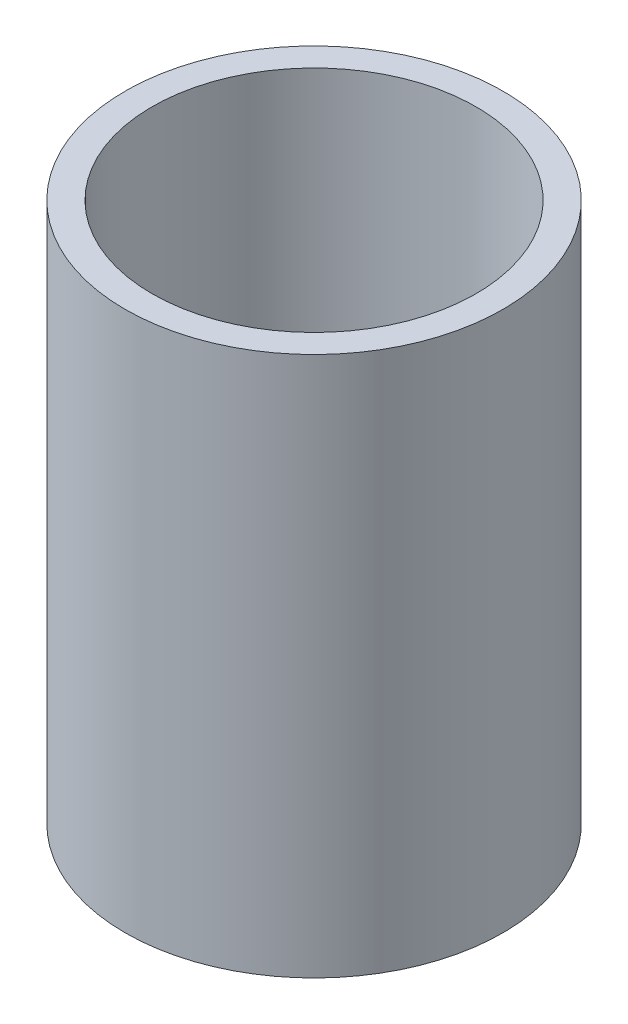
ISO-10303-21;
HEADER;
FILE_DESCRIPTION(('STEP AP214'),'2;1');
FILE_NAME('part.step','',(''),(''),'','','');
FILE_SCHEMA(('AUTOMOTIVE_DESIGN { 1 0 10303 214 1 1 1 1 }'));
ENDSEC;
DATA;
#1=APPLICATION_CONTEXT('core data for automotive mechanical design processes');
#2=APPLICATION_PROTOCOL_DEFINITION('international standard','automotive_design',2000,#1);
#3=PRODUCT_CONTEXT('',#1,'mechanical');
#4=PRODUCT('Part','Part','',(#3));
#5=PRODUCT_RELATED_PRODUCT_CATEGORY('part','',(#4));
#6=PRODUCT_DEFINITION_FORMATION('','',#4);
#7=PRODUCT_DEFINITION_CONTEXT('part definition',#1,'design');
#8=PRODUCT_DEFINITION('design','',#6,#7);
#9=PRODUCT_DEFINITION_SHAPE('','',#8);
#10=(LENGTH_UNIT() NAMED_UNIT(*) SI_UNIT(.MILLI.,.METRE.));
#11=(NAMED_UNIT(*) PLANE_ANGLE_UNIT() SI_UNIT($,.RADIAN.));
#12=(NAMED_UNIT(*) SI_UNIT($,.STERADIAN.) SOLID_ANGLE_UNIT());
#13=UNCERTAINTY_MEASURE_WITH_UNIT(LENGTH_MEASURE(1.E-05),#10,'distance_accuracy_value','');
#14=(GEOMETRIC_REPRESENTATION_CONTEXT(3) GLOBAL_UNCERTAINTY_ASSIGNED_CONTEXT((#13)) GLOBAL_UNIT_ASSIGNED_CONTEXT((#10,
#11,#12)) REPRESENTATION_CONTEXT('',''));
#15=CARTESIAN_POINT('',(0.,0.,0.));
#16=DIRECTION('',(0.,0.,1.));
#17=DIRECTION('',(1.,0.,0.));
#18=AXIS2_PLACEMENT_3D('',#15,#16,#17);
#19=CARTESIAN_POINT('',(0.,50.,0.));
#20=DIRECTION('',(0.,-1.,0.));
#21=DIRECTION('',(0.,0.,-1.));
#22=AXIS2_PLACEMENT_3D('',#19,#20,#21);
#23=CYLINDRICAL_SURFACE('',#22,17.5);
#24=CARTESIAN_POINT('',(0.,50.,0.));
#25=DIRECTION('',(0.,1.,0.));
#26=DIRECTION('',(0.,0.,1.));
#27=AXIS2_PLACEMENT_3D('',#24,#25,#26);
#28=CIRCLE('',#27,17.5);
#29=CARTESIAN_POINT('',(0.,50.,17.5));
#30=VERTEX_POINT('',#29);
#31=EDGE_CURVE('E10',#30,#30,#28,.T.);
#32=ORIENTED_EDGE('',*,*,#31,.F.);
#33=EDGE_LOOP('',(#32));
#34=FACE_BOUND('',#33,.T.);
#35=CARTESIAN_POINT('',(0.,0.,0.));
#36=DIRECTION('',(0.,1.,0.));
#37=DIRECTION('',(0.,0.,1.));
#38=AXIS2_PLACEMENT_3D('',#35,#36,#37);
#39=CIRCLE('',#38,17.5);
#40=CARTESIAN_POINT('',(0.,0.,17.5));
#41=VERTEX_POINT('',#40);
#42=EDGE_CURVE('E34',#41,#41,#39,.T.);
#43=ORIENTED_EDGE('',*,*,#42,.T.);
#44=EDGE_LOOP('',(#43));
#45=FACE_BOUND('',#44,.T.);
#46=ADVANCED_FACE('F31',(#34,#45),#23,.T.);
#47=CARTESIAN_POINT('',(0.,50.,0.));
#48=DIRECTION('',(0.,1.,0.));
#49=DIRECTION('',(0.,0.,1.));
#50=AXIS2_PLACEMENT_3D('',#47,#48,#49);
#51=PLANE('',#50);
#52=CARTESIAN_POINT('',(0.,50.,0.));
#53=DIRECTION('',(0.,1.,0.));
#54=DIRECTION('',(0.,0.,1.));
#55=AXIS2_PLACEMENT_3D('',#52,#53,#54);
#56=CIRCLE('',#55,15.);
#57=CARTESIAN_POINT('',(0.,50.,15.));
#58=VERTEX_POINT('',#57);
#59=EDGE_CURVE('E43',#58,#58,#56,.T.);
#60=ORIENTED_EDGE('',*,*,#59,.F.);
#61=EDGE_LOOP('',(#60));
#62=FACE_BOUND('',#61,.T.);
#63=ORIENTED_EDGE('',*,*,#31,.T.);
#64=EDGE_LOOP('',(#63));
#65=FACE_BOUND('',#64,.T.);
#66=ADVANCED_FACE('F58',(#62,#65),#51,.T.);
#67=CARTESIAN_POINT('',(0.,0.,0.));
#68=DIRECTION('',(0.,1.,0.));
#69=DIRECTION('',(0.,0.,1.));
#70=AXIS2_PLACEMENT_3D('',#67,#68,#69);
#71=PLANE('',#70);
#72=ORIENTED_EDGE('',*,*,#42,.F.);
#73=EDGE_LOOP('',(#72));
#74=FACE_BOUND('',#73,.T.);
#75=ADVANCED_FACE('F54',(#74),#71,.F.);
#76=CARTESIAN_POINT('',(0.,5.,0.));
#77=DIRECTION('',(0.,1.,0.));
#78=DIRECTION('',(0.,0.,1.));
#79=AXIS2_PLACEMENT_3D('',#76,#77,#78);
#80=CYLINDRICAL_SURFACE('',#79,15.);
#81=CARTESIAN_POINT('',(0.,5.,0.));
#82=DIRECTION('',(0.,1.,0.));
#83=DIRECTION('',(0.,0.,1.));
#84=AXIS2_PLACEMENT_3D('',#81,#82,#83);
#85=CIRCLE('',#84,15.);
#86=CARTESIAN_POINT('',(0.,5.,15.));
#87=VERTEX_POINT('',#86);
#88=EDGE_CURVE('E41',#87,#87,#85,.T.);
#89=CARTESIAN_POINT('',(0.,5.,15.));
#90=CARTESIAN_POINT('',(0.,5.46875,15.));
#91=CARTESIAN_POINT('',(0.,5.9375,15.));
#92=CARTESIAN_POINT('',(0.,6.875,15.));
#93=CARTESIAN_POINT('',(0.,7.34375,15.));
#94=CARTESIAN_POINT('',(0.,8.28125,15.));
#95=CARTESIAN_POINT('',(0.,8.75,15.));
#96=CARTESIAN_POINT('',(0.,9.6875,15.));
#97=CARTESIAN_POINT('',(0.,10.15625,15.));
#98=CARTESIAN_POINT('',(0.,11.09375,15.));
#99=CARTESIAN_POINT('',(0.,11.5625,15.));
#100=CARTESIAN_POINT('',(0.,12.5,15.));
#101=CARTESIAN_POINT('',(0.,12.96875,15.));
#102=CARTESIAN_POINT('',(0.,13.90625,15.));
#103=CARTESIAN_POINT('',(0.,14.375,15.));
#104=CARTESIAN_POINT('',(0.,15.3125,15.));
#105=CARTESIAN_POINT('',(0.,15.78125,15.));
#106=CARTESIAN_POINT('',(0.,16.71875,15.));
#107=CARTESIAN_POINT('',(0.,17.1875,15.));
#108=CARTESIAN_POINT('',(0.,18.125,15.));
#109=CARTESIAN_POINT('',(0.,18.59375,15.));
#110=CARTESIAN_POINT('',(0.,19.53125,15.));
#111=CARTESIAN_POINT('',(0.,20.,15.));
#112=CARTESIAN_POINT('',(0.,20.9375,15.));
#113=CARTESIAN_POINT('',(0.,21.40625,15.));
#114=CARTESIAN_POINT('',(0.,22.34375,15.));
#115=CARTESIAN_POINT('',(0.,22.8125,15.));
#116=CARTESIAN_POINT('',(0.,23.75,15.));
#117=CARTESIAN_POINT('',(0.,24.21875,15.));
#118=CARTESIAN_POINT('',(0.,25.15625,15.));
#119=CARTESIAN_POINT('',(0.,25.625,15.));
#120=CARTESIAN_POINT('',(0.,26.5625,15.));
#121=CARTESIAN_POINT('',(0.,27.03125,15.));
#122=CARTESIAN_POINT('',(0.,27.96875,15.));
#123=CARTESIAN_POINT('',(0.,28.4375,15.));
#124=CARTESIAN_POINT('',(0.,29.375,15.));
#125=CARTESIAN_POINT('',(0.,29.84375,15.));
#126=CARTESIAN_POINT('',(0.,30.78125,15.));
#127=CARTESIAN_POINT('',(0.,31.25,15.));
#128=CARTESIAN_POINT('',(0.,32.1875,15.));
#129=CARTESIAN_POINT('',(0.,32.65625,15.));
#130=CARTESIAN_POINT('',(0.,33.59375,15.));
#131=CARTESIAN_POINT('',(0.,34.0625,15.));
#132=CARTESIAN_POINT('',(0.,35.,15.));
#133=CARTESIAN_POINT('',(0.,35.46875,15.));
#134=CARTESIAN_POINT('',(0.,36.40625,15.));
#135=CARTESIAN_POINT('',(0.,36.875,15.));
#136=CARTESIAN_POINT('',(0.,37.8125,15.));
#137=CARTESIAN_POINT('',(0.,38.28125,15.));
#138=CARTESIAN_POINT('',(0.,39.21875,15.));
#139=CARTESIAN_POINT('',(0.,39.6875,15.));
#140=CARTESIAN_POINT('',(0.,40.625,15.));
#141=CARTESIAN_POINT('',(0.,41.09375,15.));
#142=CARTESIAN_POINT('',(0.,42.03125,15.));
#143=CARTESIAN_POINT('',(0.,42.5,15.));
#144=CARTESIAN_POINT('',(0.,43.4375,15.));
#145=CARTESIAN_POINT('',(0.,43.90625,15.));
#146=CARTESIAN_POINT('',(0.,44.84375,15.));
#147=CARTESIAN_POINT('',(0.,45.3125,15.));
#148=CARTESIAN_POINT('',(0.,46.25,15.));
#149=CARTESIAN_POINT('',(0.,46.71875,15.));
#150=CARTESIAN_POINT('',(0.,47.65625,15.));
#151=CARTESIAN_POINT('',(0.,48.125,15.));
#152=CARTESIAN_POINT('',(0.,49.0625,15.));
#153=CARTESIAN_POINT('',(0.,49.53125,15.));
#154=CARTESIAN_POINT('',(0.,50.,15.));
#155=B_SPLINE_CURVE_WITH_KNOTS('',3,(#89,#90,#91,#92,#93,#94,#95,#96,#97,#98,#99,#100,#101,#102,
#103,#104,#105,#106,#107,#108,#109,#110,#111,#112,#113,#114,#115,#116,#117,#118,#119,#120,#121,
#122,#123,#124,#125,#126,#127,#128,#129,#130,#131,#132,#133,#134,#135,#136,#137,#138,#139,#140,
#141,#142,#143,#144,#145,#146,#147,#148,#149,#150,#151,#152,#153,#154),.UNSPECIFIED.,.F.,.F.,(4,
2,2,2,2,2,2,2,2,2,2,2,2,2,2,2,2,2,2,2,2,2,2,2,2,2,2,2,2,2,2,2,4),(0.,1.40625,2.8125,4.21875,
5.625,7.03125,8.4375,9.84375,11.25,12.65625,14.0625,15.46875,16.875,18.28125,19.6875,21.09375,
22.5,23.90625,25.3125,26.71875,28.125,29.53125,30.9375,32.34375,33.75,35.15625,36.5625,37.96875,
39.375,40.78125,42.1875,43.59375,45.),.UNSPECIFIED.);
#156=EDGE_CURVE('BSEAM51',#87,#58,#155,.T.);
#157=ORIENTED_EDGE('',*,*,#88,.F.);
#158=ORIENTED_EDGE('',*,*,#59,.T.);
#159=ORIENTED_EDGE('',*,*,#156,.T.);
#160=ORIENTED_EDGE('',*,*,#156,.F.);
#161=EDGE_LOOP('',(#157,#159,#158,#160));
#162=FACE_BOUND('',#161,.T.);
#163=ADVANCED_FACE('F51',(#162),#80,.F.);
#164=CARTESIAN_POINT('',(0.,5.,0.));
#165=DIRECTION('',(0.,1.,0.));
#166=DIRECTION('',(0.,0.,1.));
#167=AXIS2_PLACEMENT_3D('',#164,#165,#166);
#168=PLANE('',#167);
#169=ORIENTED_EDGE('',*,*,#88,.T.);
#170=EDGE_LOOP('',(#169));
#171=FACE_BOUND('',#170,.T.);
#172=ADVANCED_FACE('F49',(#171),#168,.T.);
#173=CLOSED_SHELL('',(#46,#66,#75,#163,#172));
#174=MANIFOLD_SOLID_BREP('B2',#173);
#175=ADVANCED_BREP_SHAPE_REPRESENTATION('',(#18,#174),#14);
#176=SHAPE_DEFINITION_REPRESENTATION(#9,#175);
ENDSEC;
END-ISO-10303-21;
